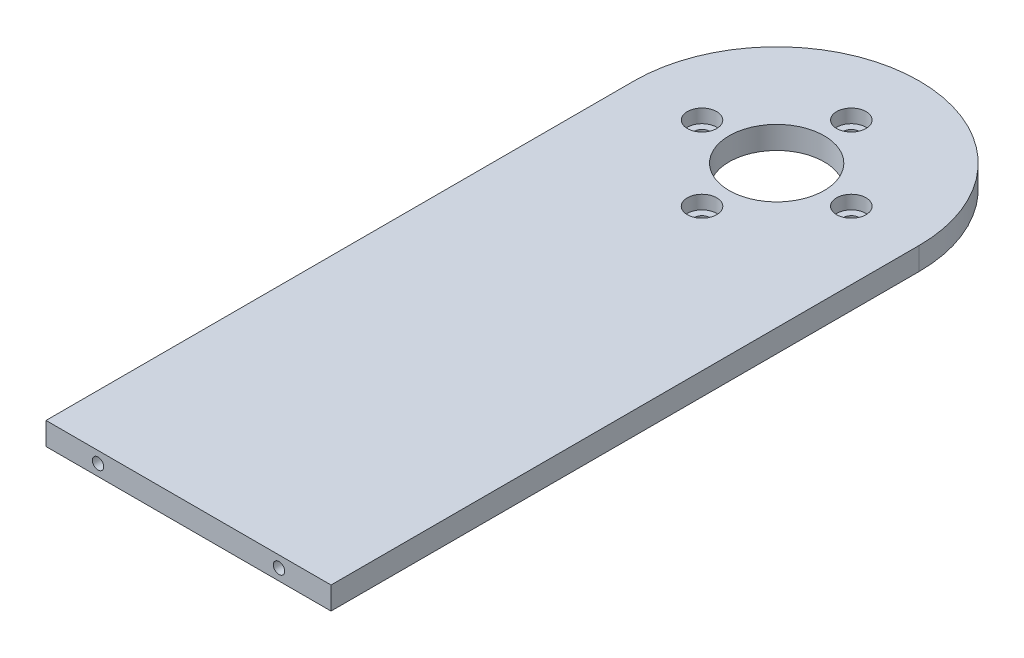
ISO-10303-21;
HEADER;
FILE_DESCRIPTION(('STEP AP214'),'2;1');
FILE_NAME('part.step','',(''),(''),'','','');
FILE_SCHEMA(('AUTOMOTIVE_DESIGN { 1 0 10303 214 1 1 1 1 }'));
ENDSEC;
DATA;
#1=APPLICATION_CONTEXT('core data for automotive mechanical design processes');
#2=APPLICATION_PROTOCOL_DEFINITION('international standard','automotive_design',2000,#1);
#3=PRODUCT_CONTEXT('',#1,'mechanical');
#4=PRODUCT('Part','Part','',(#3));
#5=PRODUCT_RELATED_PRODUCT_CATEGORY('part','',(#4));
#6=PRODUCT_DEFINITION_FORMATION('','',#4);
#7=PRODUCT_DEFINITION_CONTEXT('part definition',#1,'design');
#8=PRODUCT_DEFINITION('design','',#6,#7);
#9=PRODUCT_DEFINITION_SHAPE('','',#8);
#10=(LENGTH_UNIT() NAMED_UNIT(*) SI_UNIT(.MILLI.,.METRE.));
#11=(NAMED_UNIT(*) PLANE_ANGLE_UNIT() SI_UNIT($,.RADIAN.));
#12=(NAMED_UNIT(*) SI_UNIT($,.STERADIAN.) SOLID_ANGLE_UNIT());
#13=UNCERTAINTY_MEASURE_WITH_UNIT(LENGTH_MEASURE(1.E-05),#10,'distance_accuracy_value','');
#14=(GEOMETRIC_REPRESENTATION_CONTEXT(3) GLOBAL_UNCERTAINTY_ASSIGNED_CONTEXT((#13)) GLOBAL_UNIT_ASSIGNED_CONTEXT((#10,
#11,#12)) REPRESENTATION_CONTEXT('',''));
#15=CARTESIAN_POINT('',(0.,0.,0.));
#16=DIRECTION('',(0.,0.,1.));
#17=DIRECTION('',(1.,0.,0.));
#18=AXIS2_PLACEMENT_3D('',#15,#16,#17);
#19=CARTESIAN_POINT('',(0.,5.,0.));
#20=DIRECTION('',(0.,0.,-1.));
#21=DIRECTION('',(-1.,0.,0.));
#22=AXIS2_PLACEMENT_3D('',#19,#20,#21);
#23=PLANE('',#22);
#24=CARTESIAN_POINT('',(11.5,2.5,0.));
#25=DIRECTION('',(0.,0.,1.));
#26=DIRECTION('',(1.,0.,0.));
#27=AXIS2_PLACEMENT_3D('',#24,#25,#26);
#28=CIRCLE('',#27,1.25);
#29=CARTESIAN_POINT('',(12.75,2.5,0.));
#30=VERTEX_POINT('',#29);
#31=EDGE_CURVE('E98',#30,#30,#28,.T.);
#32=ORIENTED_EDGE('',*,*,#31,.F.);
#33=EDGE_LOOP('',(#32));
#34=FACE_BOUND('',#33,.T.);
#35=CARTESIAN_POINT('',(51.5,2.5,0.));
#36=DIRECTION('',(0.,0.,1.));
#37=DIRECTION('',(1.,0.,0.));
#38=AXIS2_PLACEMENT_3D('',#35,#36,#37);
#39=CIRCLE('',#38,1.25);
#40=CARTESIAN_POINT('',(52.75,2.5,0.));
#41=VERTEX_POINT('',#40);
#42=EDGE_CURVE('E97',#41,#41,#39,.T.);
#43=ORIENTED_EDGE('',*,*,#42,.F.);
#44=EDGE_LOOP('',(#43));
#45=FACE_BOUND('',#44,.T.);
#46=DIRECTION('',(1.,0.,0.));
#47=VECTOR('',#46,1.);
#48=CARTESIAN_POINT('',(0.,0.,0.));
#49=LINE('',#48,#47);
#50=CARTESIAN_POINT('',(0.,0.,0.));
#51=VERTEX_POINT('',#50);
#52=CARTESIAN_POINT('',(63.,0.,0.));
#53=VERTEX_POINT('',#52);
#54=EDGE_CURVE('E110',#51,#53,#49,.T.);
#55=ORIENTED_EDGE('',*,*,#54,.T.);
#56=DIRECTION('',(0.,-1.,0.));
#57=VECTOR('',#56,1.);
#58=CARTESIAN_POINT('',(63.,5.,0.));
#59=LINE('',#58,#57);
#60=CARTESIAN_POINT('',(63.,5.,0.));
#61=VERTEX_POINT('',#60);
#62=EDGE_CURVE('E11',#61,#53,#59,.T.);
#63=ORIENTED_EDGE('',*,*,#62,.F.);
#64=DIRECTION('',(1.,0.,0.));
#65=VECTOR('',#64,1.);
#66=CARTESIAN_POINT('',(0.,5.,0.));
#67=LINE('',#66,#65);
#68=CARTESIAN_POINT('',(0.,5.,0.));
#69=VERTEX_POINT('',#68);
#70=EDGE_CURVE('E111',#69,#61,#67,.T.);
#71=ORIENTED_EDGE('',*,*,#70,.F.);
#72=DIRECTION('',(0.,-1.,0.));
#73=VECTOR('',#72,1.);
#74=CARTESIAN_POINT('',(0.,5.,0.));
#75=LINE('',#74,#73);
#76=EDGE_CURVE('E53',#69,#51,#75,.T.);
#77=ORIENTED_EDGE('',*,*,#76,.T.);
#78=EDGE_LOOP('',(#55,#63,#71,#77));
#79=FACE_BOUND('',#78,.T.);
#80=ADVANCED_FACE('F37',(#34,#45,#79),#23,.F.);
#81=CARTESIAN_POINT('',(63.,5.,0.));
#82=DIRECTION('',(-1.,0.,0.));
#83=DIRECTION('',(0.,0.,1.));
#84=AXIS2_PLACEMENT_3D('',#81,#82,#83);
#85=PLANE('',#84);
#86=DIRECTION('',(0.,0.,-1.));
#87=VECTOR('',#86,1.);
#88=CARTESIAN_POINT('',(63.,0.,0.));
#89=LINE('',#88,#87);
#90=CARTESIAN_POINT('',(63.,0.,-130.));
#91=VERTEX_POINT('',#90);
#92=EDGE_CURVE('E121',#53,#91,#89,.T.);
#93=ORIENTED_EDGE('',*,*,#92,.T.);
#94=DIRECTION('',(0.,-1.,0.));
#95=VECTOR('',#94,1.);
#96=CARTESIAN_POINT('',(63.,5.,-130.));
#97=LINE('',#96,#95);
#98=CARTESIAN_POINT('',(63.,5.,-130.));
#99=VERTEX_POINT('',#98);
#100=EDGE_CURVE('E45',#99,#91,#97,.T.);
#101=ORIENTED_EDGE('',*,*,#100,.F.);
#102=DIRECTION('',(0.,0.,-1.));
#103=VECTOR('',#102,1.);
#104=CARTESIAN_POINT('',(63.,5.,0.));
#105=LINE('',#104,#103);
#106=EDGE_CURVE('E79',#61,#99,#105,.T.);
#107=ORIENTED_EDGE('',*,*,#106,.F.);
#108=ORIENTED_EDGE('',*,*,#62,.T.);
#109=EDGE_LOOP('',(#93,#101,#107,#108));
#110=FACE_BOUND('',#109,.T.);
#111=ADVANCED_FACE('F133',(#110),#85,.F.);
#112=CARTESIAN_POINT('',(31.5,5.,-130.));
#113=DIRECTION('',(0.,-1.,0.));
#114=DIRECTION('',(0.,0.,-1.));
#115=AXIS2_PLACEMENT_3D('',#112,#113,#114);
#116=CYLINDRICAL_SURFACE('',#115,31.5);
#117=CARTESIAN_POINT('',(31.5,0.,-130.));
#118=DIRECTION('',(0.,-1.,0.));
#119=DIRECTION('',(0.,0.,-1.));
#120=AXIS2_PLACEMENT_3D('',#117,#118,#119);
#121=CIRCLE('',#120,31.5);
#122=CARTESIAN_POINT('',(0.,0.,-130.));
#123=VERTEX_POINT('',#122);
#124=EDGE_CURVE('E124',#123,#91,#121,.T.);
#125=ORIENTED_EDGE('',*,*,#124,.F.);
#126=DIRECTION('',(0.,-1.,0.));
#127=VECTOR('',#126,1.);
#128=CARTESIAN_POINT('',(0.,5.,-130.));
#129=LINE('',#128,#127);
#130=CARTESIAN_POINT('',(0.,5.,-130.));
#131=VERTEX_POINT('',#130);
#132=EDGE_CURVE('E68',#131,#123,#129,.T.);
#133=ORIENTED_EDGE('',*,*,#132,.F.);
#134=CARTESIAN_POINT('',(31.5,5.,-130.));
#135=DIRECTION('',(0.,-1.,0.));
#136=DIRECTION('',(0.,0.,-1.));
#137=AXIS2_PLACEMENT_3D('',#134,#135,#136);
#138=CIRCLE('',#137,31.5);
#139=EDGE_CURVE('E115',#131,#99,#138,.T.);
#140=ORIENTED_EDGE('',*,*,#139,.T.);
#141=ORIENTED_EDGE('',*,*,#100,.T.);
#142=EDGE_LOOP('',(#125,#133,#140,#141));
#143=FACE_BOUND('',#142,.T.);
#144=ADVANCED_FACE('F131',(#143),#116,.T.);
#145=CARTESIAN_POINT('',(0.,5.,0.));
#146=DIRECTION('',(-1.,0.,0.));
#147=DIRECTION('',(0.,0.,1.));
#148=AXIS2_PLACEMENT_3D('',#145,#146,#147);
#149=PLANE('',#148);
#150=DIRECTION('',(0.,0.,-1.));
#151=VECTOR('',#150,1.);
#152=CARTESIAN_POINT('',(0.,0.,0.));
#153=LINE('',#152,#151);
#154=EDGE_CURVE('E113',#51,#123,#153,.T.);
#155=ORIENTED_EDGE('',*,*,#154,.F.);
#156=ORIENTED_EDGE('',*,*,#76,.F.);
#157=DIRECTION('',(0.,0.,-1.));
#158=VECTOR('',#157,1.);
#159=CARTESIAN_POINT('',(0.,5.,0.));
#160=LINE('',#159,#158);
#161=EDGE_CURVE('E118',#69,#131,#160,.T.);
#162=ORIENTED_EDGE('',*,*,#161,.T.);
#163=ORIENTED_EDGE('',*,*,#132,.T.);
#164=EDGE_LOOP('',(#155,#156,#162,#163));
#165=FACE_BOUND('',#164,.T.);
#166=ADVANCED_FACE('F137',(#165),#149,.T.);
#167=CARTESIAN_POINT('',(31.5,5.,-130.));
#168=DIRECTION('',(0.,-1.,0.));
#169=DIRECTION('',(0.,0.,-1.));
#170=AXIS2_PLACEMENT_3D('',#167,#168,#169);
#171=PLANE('',#170);
#172=CARTESIAN_POINT('',(31.5,5.,-130.));
#173=DIRECTION('',(0.,1.,0.));
#174=DIRECTION('',(0.,0.,1.));
#175=AXIS2_PLACEMENT_3D('',#172,#173,#174);
#176=CIRCLE('',#175,10.5);
#177=CARTESIAN_POINT('',(31.5,5.,-119.5));
#178=VERTEX_POINT('',#177);
#179=EDGE_CURVE('E234',#178,#178,#176,.T.);
#180=ORIENTED_EDGE('',*,*,#179,.F.);
#181=EDGE_LOOP('',(#180));
#182=FACE_BOUND('',#181,.T.);
#183=CARTESIAN_POINT('',(15.,5.,-130.));
#184=DIRECTION('',(0.,1.,0.));
#185=DIRECTION('',(0.,0.,1.));
#186=AXIS2_PLACEMENT_3D('',#183,#184,#185);
#187=CIRCLE('',#186,3.25);
#188=CARTESIAN_POINT('',(15.,5.,-126.75));
#189=VERTEX_POINT('',#188);
#190=EDGE_CURVE('E231',#189,#189,#187,.T.);
#191=ORIENTED_EDGE('',*,*,#190,.F.);
#192=EDGE_LOOP('',(#191));
#193=FACE_BOUND('',#192,.T.);
#194=CARTESIAN_POINT('',(31.5,5.,-113.5));
#195=DIRECTION('',(0.,1.,0.));
#196=DIRECTION('',(0.,0.,1.));
#197=AXIS2_PLACEMENT_3D('',#194,#195,#196);
#198=CIRCLE('',#197,3.25);
#199=CARTESIAN_POINT('',(31.5,5.,-110.25));
#200=VERTEX_POINT('',#199);
#201=EDGE_CURVE('E221',#200,#200,#198,.T.);
#202=ORIENTED_EDGE('',*,*,#201,.F.);
#203=EDGE_LOOP('',(#202));
#204=FACE_BOUND('',#203,.T.);
#205=CARTESIAN_POINT('',(48.,5.,-130.));
#206=DIRECTION('',(0.,1.,0.));
#207=DIRECTION('',(0.,0.,1.));
#208=AXIS2_PLACEMENT_3D('',#205,#206,#207);
#209=CIRCLE('',#208,3.25);
#210=CARTESIAN_POINT('',(48.,5.,-126.75));
#211=VERTEX_POINT('',#210);
#212=EDGE_CURVE('E211',#211,#211,#209,.T.);
#213=ORIENTED_EDGE('',*,*,#212,.F.);
#214=EDGE_LOOP('',(#213));
#215=FACE_BOUND('',#214,.T.);
#216=CARTESIAN_POINT('',(31.5,5.,-146.5));
#217=DIRECTION('',(0.,1.,0.));
#218=DIRECTION('',(0.,0.,1.));
#219=AXIS2_PLACEMENT_3D('',#216,#217,#218);
#220=CIRCLE('',#219,3.25);
#221=CARTESIAN_POINT('',(31.5,5.,-143.25));
#222=VERTEX_POINT('',#221);
#223=EDGE_CURVE('E201',#222,#222,#220,.T.);
#224=ORIENTED_EDGE('',*,*,#223,.F.);
#225=EDGE_LOOP('',(#224));
#226=FACE_BOUND('',#225,.T.);
#227=ORIENTED_EDGE('',*,*,#70,.T.);
#228=ORIENTED_EDGE('',*,*,#106,.T.);
#229=ORIENTED_EDGE('',*,*,#139,.F.);
#230=ORIENTED_EDGE('',*,*,#161,.F.);
#231=EDGE_LOOP('',(#227,#228,#229,#230));
#232=FACE_BOUND('',#231,.T.);
#233=ADVANCED_FACE('F139',(#182,#193,#204,#215,#226,#232),#171,.F.);
#234=CARTESIAN_POINT('',(31.5,0.,-130.));
#235=DIRECTION('',(0.,-1.,0.));
#236=DIRECTION('',(0.,0.,-1.));
#237=AXIS2_PLACEMENT_3D('',#234,#235,#236);
#238=PLANE('',#237);
#239=CARTESIAN_POINT('',(31.5,0.,-130.));
#240=DIRECTION('',(0.,1.,0.));
#241=DIRECTION('',(0.,0.,1.));
#242=AXIS2_PLACEMENT_3D('',#239,#240,#241);
#243=CIRCLE('',#242,10.5);
#244=CARTESIAN_POINT('',(31.5,0.,-119.5));
#245=VERTEX_POINT('',#244);
#246=EDGE_CURVE('E178',#245,#245,#243,.T.);
#247=ORIENTED_EDGE('',*,*,#246,.T.);
#248=EDGE_LOOP('',(#247));
#249=FACE_BOUND('',#248,.T.);
#250=CARTESIAN_POINT('',(15.,0.,-130.));
#251=DIRECTION('',(0.,1.,0.));
#252=DIRECTION('',(0.,0.,1.));
#253=AXIS2_PLACEMENT_3D('',#250,#251,#252);
#254=CIRCLE('',#253,1.7);
#255=CARTESIAN_POINT('',(15.,0.,-128.3));
#256=VERTEX_POINT('',#255);
#257=EDGE_CURVE('E182',#256,#256,#254,.T.);
#258=ORIENTED_EDGE('',*,*,#257,.T.);
#259=EDGE_LOOP('',(#258));
#260=FACE_BOUND('',#259,.T.);
#261=CARTESIAN_POINT('',(31.5,0.,-113.5));
#262=DIRECTION('',(0.,1.,0.));
#263=DIRECTION('',(0.,0.,1.));
#264=AXIS2_PLACEMENT_3D('',#261,#262,#263);
#265=CIRCLE('',#264,1.7);
#266=CARTESIAN_POINT('',(31.5,0.,-111.8));
#267=VERTEX_POINT('',#266);
#268=EDGE_CURVE('E186',#267,#267,#265,.T.);
#269=ORIENTED_EDGE('',*,*,#268,.T.);
#270=EDGE_LOOP('',(#269));
#271=FACE_BOUND('',#270,.T.);
#272=CARTESIAN_POINT('',(48.,0.,-130.));
#273=DIRECTION('',(0.,1.,0.));
#274=DIRECTION('',(0.,0.,1.));
#275=AXIS2_PLACEMENT_3D('',#272,#273,#274);
#276=CIRCLE('',#275,1.7);
#277=CARTESIAN_POINT('',(48.,0.,-128.3));
#278=VERTEX_POINT('',#277);
#279=EDGE_CURVE('E190',#278,#278,#276,.T.);
#280=ORIENTED_EDGE('',*,*,#279,.T.);
#281=EDGE_LOOP('',(#280));
#282=FACE_BOUND('',#281,.T.);
#283=CARTESIAN_POINT('',(31.5,0.,-146.5));
#284=DIRECTION('',(0.,1.,0.));
#285=DIRECTION('',(0.,0.,1.));
#286=AXIS2_PLACEMENT_3D('',#283,#284,#285);
#287=CIRCLE('',#286,1.7);
#288=CARTESIAN_POINT('',(31.5,0.,-144.8));
#289=VERTEX_POINT('',#288);
#290=EDGE_CURVE('E104',#289,#289,#287,.T.);
#291=ORIENTED_EDGE('',*,*,#290,.T.);
#292=EDGE_LOOP('',(#291));
#293=FACE_BOUND('',#292,.T.);
#294=ORIENTED_EDGE('',*,*,#54,.F.);
#295=ORIENTED_EDGE('',*,*,#154,.T.);
#296=ORIENTED_EDGE('',*,*,#124,.T.);
#297=ORIENTED_EDGE('',*,*,#92,.F.);
#298=EDGE_LOOP('',(#294,#295,#296,#297));
#299=FACE_BOUND('',#298,.T.);
#300=ADVANCED_FACE('F136',(#249,#260,#271,#282,#293,#299),#238,.T.);
#301=CARTESIAN_POINT('',(51.5,2.5,-7.5));
#302=DIRECTION('',(0.,0.,1.));
#303=DIRECTION('',(1.,0.,0.));
#304=AXIS2_PLACEMENT_3D('',#301,#302,#303);
#305=CONICAL_SURFACE('',#304,1.25,1.02974425867665);
#306=CARTESIAN_POINT('',(51.5,2.5,-8.25107577378445));
#307=VERTEX_POINT('',#306);
#308=VERTEX_LOOP('',#307);
#309=FACE_BOUND('',#308,.T.);
#310=CARTESIAN_POINT('',(51.5,2.5,-7.5));
#311=DIRECTION('',(0.,0.,1.));
#312=DIRECTION('',(1.,0.,0.));
#313=AXIS2_PLACEMENT_3D('',#310,#311,#312);
#314=CIRCLE('',#313,1.25);
#315=CARTESIAN_POINT('',(52.75,2.5,-7.5));
#316=VERTEX_POINT('',#315);
#317=EDGE_CURVE('E101',#316,#316,#314,.T.);
#318=ORIENTED_EDGE('',*,*,#317,.T.);
#319=EDGE_LOOP('',(#318));
#320=FACE_BOUND('',#319,.T.);
#321=ADVANCED_FACE('F161',(#309,#320),#305,.F.);
#322=CARTESIAN_POINT('',(51.5,2.5,0.));
#323=DIRECTION('',(0.,0.,1.));
#324=DIRECTION('',(1.,0.,0.));
#325=AXIS2_PLACEMENT_3D('',#322,#323,#324);
#326=CYLINDRICAL_SURFACE('',#325,1.25);
#327=ORIENTED_EDGE('',*,*,#317,.F.);
#328=EDGE_LOOP('',(#327));
#329=FACE_BOUND('',#328,.T.);
#330=ORIENTED_EDGE('',*,*,#42,.T.);
#331=EDGE_LOOP('',(#330));
#332=FACE_BOUND('',#331,.T.);
#333=ADVANCED_FACE('F91',(#329,#332),#326,.F.);
#334=CARTESIAN_POINT('',(11.5,2.5,-7.5));
#335=DIRECTION('',(0.,0.,1.));
#336=DIRECTION('',(1.,0.,0.));
#337=AXIS2_PLACEMENT_3D('',#334,#335,#336);
#338=CONICAL_SURFACE('',#337,1.25,1.02974425867665);
#339=CARTESIAN_POINT('',(11.5,2.5,-8.25107577378445));
#340=VERTEX_POINT('',#339);
#341=VERTEX_LOOP('',#340);
#342=FACE_BOUND('',#341,.T.);
#343=CARTESIAN_POINT('',(11.5,2.5,-7.5));
#344=DIRECTION('',(0.,0.,1.));
#345=DIRECTION('',(1.,0.,0.));
#346=AXIS2_PLACEMENT_3D('',#343,#344,#345);
#347=CIRCLE('',#346,1.25);
#348=CARTESIAN_POINT('',(12.75,2.5,-7.5));
#349=VERTEX_POINT('',#348);
#350=EDGE_CURVE('E95',#349,#349,#347,.T.);
#351=ORIENTED_EDGE('',*,*,#350,.T.);
#352=EDGE_LOOP('',(#351));
#353=FACE_BOUND('',#352,.T.);
#354=ADVANCED_FACE('F87',(#342,#353),#338,.F.);
#355=CARTESIAN_POINT('',(11.5,2.5,0.));
#356=DIRECTION('',(0.,0.,1.));
#357=DIRECTION('',(1.,0.,0.));
#358=AXIS2_PLACEMENT_3D('',#355,#356,#357);
#359=CYLINDRICAL_SURFACE('',#358,1.25);
#360=ORIENTED_EDGE('',*,*,#350,.F.);
#361=EDGE_LOOP('',(#360));
#362=FACE_BOUND('',#361,.T.);
#363=ORIENTED_EDGE('',*,*,#31,.T.);
#364=EDGE_LOOP('',(#363));
#365=FACE_BOUND('',#364,.T.);
#366=ADVANCED_FACE('F90',(#362,#365),#359,.F.);
#367=CARTESIAN_POINT('',(31.5,5.,-146.5));
#368=DIRECTION('',(0.,1.,0.));
#369=DIRECTION('',(0.,0.,1.));
#370=AXIS2_PLACEMENT_3D('',#367,#368,#369);
#371=CYLINDRICAL_SURFACE('',#370,1.7);
#372=ORIENTED_EDGE('',*,*,#290,.F.);
#373=EDGE_LOOP('',(#372));
#374=FACE_BOUND('',#373,.T.);
#375=CARTESIAN_POINT('',(31.5,2.,-146.5));
#376=DIRECTION('',(0.,1.,0.));
#377=DIRECTION('',(0.,0.,1.));
#378=AXIS2_PLACEMENT_3D('',#375,#376,#377);
#379=CIRCLE('',#378,1.7);
#380=CARTESIAN_POINT('',(31.5,2.,-144.8));
#381=VERTEX_POINT('',#380);
#382=EDGE_CURVE('E194',#381,#381,#379,.T.);
#383=ORIENTED_EDGE('',*,*,#382,.T.);
#384=EDGE_LOOP('',(#383));
#385=FACE_BOUND('',#384,.T.);
#386=ADVANCED_FACE('F262',(#374,#385),#371,.F.);
#387=CARTESIAN_POINT('',(33.2,2.,-146.5));
#388=DIRECTION('',(0.,-1.,0.));
#389=DIRECTION('',(0.,0.,-1.));
#390=AXIS2_PLACEMENT_3D('',#387,#388,#389);
#391=PLANE('',#390);
#392=ORIENTED_EDGE('',*,*,#382,.F.);
#393=EDGE_LOOP('',(#392));
#394=FACE_BOUND('',#393,.T.);
#395=CARTESIAN_POINT('',(31.5,2.,-146.5));
#396=DIRECTION('',(0.,1.,0.));
#397=DIRECTION('',(0.,0.,1.));
#398=AXIS2_PLACEMENT_3D('',#395,#396,#397);
#399=CIRCLE('',#398,3.25);
#400=CARTESIAN_POINT('',(31.5,2.,-143.25));
#401=VERTEX_POINT('',#400);
#402=EDGE_CURVE('E196',#401,#401,#399,.T.);
#403=ORIENTED_EDGE('',*,*,#402,.T.);
#404=EDGE_LOOP('',(#403));
#405=FACE_BOUND('',#404,.T.);
#406=ADVANCED_FACE('F252',(#394,#405),#391,.F.);
#407=CARTESIAN_POINT('',(31.5,5.,-146.5));
#408=DIRECTION('',(0.,1.,0.));
#409=DIRECTION('',(0.,0.,1.));
#410=AXIS2_PLACEMENT_3D('',#407,#408,#409);
#411=CYLINDRICAL_SURFACE('',#410,3.25);
#412=ORIENTED_EDGE('',*,*,#402,.F.);
#413=EDGE_LOOP('',(#412));
#414=FACE_BOUND('',#413,.T.);
#415=ORIENTED_EDGE('',*,*,#223,.T.);
#416=EDGE_LOOP('',(#415));
#417=FACE_BOUND('',#416,.T.);
#418=ADVANCED_FACE('F249',(#414,#417),#411,.F.);
#419=CARTESIAN_POINT('',(48.,5.,-130.));
#420=DIRECTION('',(0.,1.,0.));
#421=DIRECTION('',(0.,0.,1.));
#422=AXIS2_PLACEMENT_3D('',#419,#420,#421);
#423=CYLINDRICAL_SURFACE('',#422,1.7);
#424=ORIENTED_EDGE('',*,*,#279,.F.);
#425=EDGE_LOOP('',(#424));
#426=FACE_BOUND('',#425,.T.);
#427=CARTESIAN_POINT('',(48.,2.,-130.));
#428=DIRECTION('',(0.,1.,0.));
#429=DIRECTION('',(0.,0.,1.));
#430=AXIS2_PLACEMENT_3D('',#427,#428,#429);
#431=CIRCLE('',#430,1.7);
#432=CARTESIAN_POINT('',(48.,2.,-128.3));
#433=VERTEX_POINT('',#432);
#434=EDGE_CURVE('E205',#433,#433,#431,.T.);
#435=ORIENTED_EDGE('',*,*,#434,.T.);
#436=EDGE_LOOP('',(#435));
#437=FACE_BOUND('',#436,.T.);
#438=ADVANCED_FACE('F251',(#426,#437),#423,.F.);
#439=CARTESIAN_POINT('',(49.7,2.,-130.));
#440=DIRECTION('',(0.,-1.,0.));
#441=DIRECTION('',(0.,0.,-1.));
#442=AXIS2_PLACEMENT_3D('',#439,#440,#441);
#443=PLANE('',#442);
#444=ORIENTED_EDGE('',*,*,#434,.F.);
#445=EDGE_LOOP('',(#444));
#446=FACE_BOUND('',#445,.T.);
#447=CARTESIAN_POINT('',(48.,2.,-130.));
#448=DIRECTION('',(0.,1.,0.));
#449=DIRECTION('',(0.,0.,1.));
#450=AXIS2_PLACEMENT_3D('',#447,#448,#449);
#451=CIRCLE('',#450,3.25);
#452=CARTESIAN_POINT('',(48.,2.,-126.75));
#453=VERTEX_POINT('',#452);
#454=EDGE_CURVE('E208',#453,#453,#451,.T.);
#455=ORIENTED_EDGE('',*,*,#454,.T.);
#456=EDGE_LOOP('',(#455));
#457=FACE_BOUND('',#456,.T.);
#458=ADVANCED_FACE('F259',(#446,#457),#443,.F.);
#459=CARTESIAN_POINT('',(48.,5.,-130.));
#460=DIRECTION('',(0.,1.,0.));
#461=DIRECTION('',(0.,0.,1.));
#462=AXIS2_PLACEMENT_3D('',#459,#460,#461);
#463=CYLINDRICAL_SURFACE('',#462,3.25);
#464=ORIENTED_EDGE('',*,*,#454,.F.);
#465=EDGE_LOOP('',(#464));
#466=FACE_BOUND('',#465,.T.);
#467=ORIENTED_EDGE('',*,*,#212,.T.);
#468=EDGE_LOOP('',(#467));
#469=FACE_BOUND('',#468,.T.);
#470=ADVANCED_FACE('F303',(#466,#469),#463,.F.);
#471=CARTESIAN_POINT('',(31.5,5.,-113.5));
#472=DIRECTION('',(0.,1.,0.));
#473=DIRECTION('',(0.,0.,1.));
#474=AXIS2_PLACEMENT_3D('',#471,#472,#473);
#475=CYLINDRICAL_SURFACE('',#474,1.7);
#476=ORIENTED_EDGE('',*,*,#268,.F.);
#477=EDGE_LOOP('',(#476));
#478=FACE_BOUND('',#477,.T.);
#479=CARTESIAN_POINT('',(31.5,2.,-113.5));
#480=DIRECTION('',(0.,1.,0.));
#481=DIRECTION('',(0.,0.,1.));
#482=AXIS2_PLACEMENT_3D('',#479,#480,#481);
#483=CIRCLE('',#482,1.7);
#484=CARTESIAN_POINT('',(31.5,2.,-111.8));
#485=VERTEX_POINT('',#484);
#486=EDGE_CURVE('E215',#485,#485,#483,.T.);
#487=ORIENTED_EDGE('',*,*,#486,.T.);
#488=EDGE_LOOP('',(#487));
#489=FACE_BOUND('',#488,.T.);
#490=ADVANCED_FACE('F312',(#478,#489),#475,.F.);
#491=CARTESIAN_POINT('',(33.2,2.,-113.5));
#492=DIRECTION('',(0.,-1.,0.));
#493=DIRECTION('',(0.,0.,-1.));
#494=AXIS2_PLACEMENT_3D('',#491,#492,#493);
#495=PLANE('',#494);
#496=ORIENTED_EDGE('',*,*,#486,.F.);
#497=EDGE_LOOP('',(#496));
#498=FACE_BOUND('',#497,.T.);
#499=CARTESIAN_POINT('',(31.5,2.,-113.5));
#500=DIRECTION('',(0.,1.,0.));
#501=DIRECTION('',(0.,0.,1.));
#502=AXIS2_PLACEMENT_3D('',#499,#500,#501);
#503=CIRCLE('',#502,3.25);
#504=CARTESIAN_POINT('',(31.5,2.,-110.25));
#505=VERTEX_POINT('',#504);
#506=EDGE_CURVE('E218',#505,#505,#503,.T.);
#507=ORIENTED_EDGE('',*,*,#506,.T.);
#508=EDGE_LOOP('',(#507));
#509=FACE_BOUND('',#508,.T.);
#510=ADVANCED_FACE('F322',(#498,#509),#495,.F.);
#511=CARTESIAN_POINT('',(31.5,5.,-113.5));
#512=DIRECTION('',(0.,1.,0.));
#513=DIRECTION('',(0.,0.,1.));
#514=AXIS2_PLACEMENT_3D('',#511,#512,#513);
#515=CYLINDRICAL_SURFACE('',#514,3.25);
#516=ORIENTED_EDGE('',*,*,#506,.F.);
#517=EDGE_LOOP('',(#516));
#518=FACE_BOUND('',#517,.T.);
#519=ORIENTED_EDGE('',*,*,#201,.T.);
#520=EDGE_LOOP('',(#519));
#521=FACE_BOUND('',#520,.T.);
#522=ADVANCED_FACE('F332',(#518,#521),#515,.F.);
#523=CARTESIAN_POINT('',(15.,5.,-130.));
#524=DIRECTION('',(0.,1.,0.));
#525=DIRECTION('',(0.,0.,1.));
#526=AXIS2_PLACEMENT_3D('',#523,#524,#525);
#527=CYLINDRICAL_SURFACE('',#526,1.7);
#528=ORIENTED_EDGE('',*,*,#257,.F.);
#529=EDGE_LOOP('',(#528));
#530=FACE_BOUND('',#529,.T.);
#531=CARTESIAN_POINT('',(15.,2.,-130.));
#532=DIRECTION('',(0.,1.,0.));
#533=DIRECTION('',(0.,0.,1.));
#534=AXIS2_PLACEMENT_3D('',#531,#532,#533);
#535=CIRCLE('',#534,1.7);
#536=CARTESIAN_POINT('',(15.,2.,-128.3));
#537=VERTEX_POINT('',#536);
#538=EDGE_CURVE('E225',#537,#537,#535,.T.);
#539=ORIENTED_EDGE('',*,*,#538,.T.);
#540=EDGE_LOOP('',(#539));
#541=FACE_BOUND('',#540,.T.);
#542=ADVANCED_FACE('F342',(#530,#541),#527,.F.);
#543=CARTESIAN_POINT('',(16.7,2.,-130.));
#544=DIRECTION('',(0.,-1.,0.));
#545=DIRECTION('',(0.,0.,-1.));
#546=AXIS2_PLACEMENT_3D('',#543,#544,#545);
#547=PLANE('',#546);
#548=ORIENTED_EDGE('',*,*,#538,.F.);
#549=EDGE_LOOP('',(#548));
#550=FACE_BOUND('',#549,.T.);
#551=CARTESIAN_POINT('',(15.,2.,-130.));
#552=DIRECTION('',(0.,1.,0.));
#553=DIRECTION('',(0.,0.,1.));
#554=AXIS2_PLACEMENT_3D('',#551,#552,#553);
#555=CIRCLE('',#554,3.25);
#556=CARTESIAN_POINT('',(15.,2.,-126.75));
#557=VERTEX_POINT('',#556);
#558=EDGE_CURVE('E228',#557,#557,#555,.T.);
#559=ORIENTED_EDGE('',*,*,#558,.T.);
#560=EDGE_LOOP('',(#559));
#561=FACE_BOUND('',#560,.T.);
#562=ADVANCED_FACE('F352',(#550,#561),#547,.F.);
#563=CARTESIAN_POINT('',(15.,5.,-130.));
#564=DIRECTION('',(0.,1.,0.));
#565=DIRECTION('',(0.,0.,1.));
#566=AXIS2_PLACEMENT_3D('',#563,#564,#565);
#567=CYLINDRICAL_SURFACE('',#566,3.25);
#568=ORIENTED_EDGE('',*,*,#558,.F.);
#569=EDGE_LOOP('',(#568));
#570=FACE_BOUND('',#569,.T.);
#571=ORIENTED_EDGE('',*,*,#190,.T.);
#572=EDGE_LOOP('',(#571));
#573=FACE_BOUND('',#572,.T.);
#574=ADVANCED_FACE('F362',(#570,#573),#567,.F.);
#575=CARTESIAN_POINT('',(31.5,0.,-130.));
#576=DIRECTION('',(0.,1.,0.));
#577=DIRECTION('',(0.,0.,1.));
#578=AXIS2_PLACEMENT_3D('',#575,#576,#577);
#579=CYLINDRICAL_SURFACE('',#578,10.5);
#580=ORIENTED_EDGE('',*,*,#246,.F.);
#581=EDGE_LOOP('',(#580));
#582=FACE_BOUND('',#581,.T.);
#583=ORIENTED_EDGE('',*,*,#179,.T.);
#584=EDGE_LOOP('',(#583));
#585=FACE_BOUND('',#584,.T.);
#586=ADVANCED_FACE('F239',(#582,#585),#579,.F.);
#587=CLOSED_SHELL('',(#80,#111,#144,#166,#233,#300,#321,#333,#354,#366,#386,#406,#418,#438,#458,
#470,#490,#510,#522,#542,#562,#574,#586));
#588=MANIFOLD_SOLID_BREP('B2',#587);
#589=ADVANCED_BREP_SHAPE_REPRESENTATION('',(#18,#588),#14);
#590=SHAPE_DEFINITION_REPRESENTATION(#9,#589);
ENDSEC;
END-ISO-10303-21;
